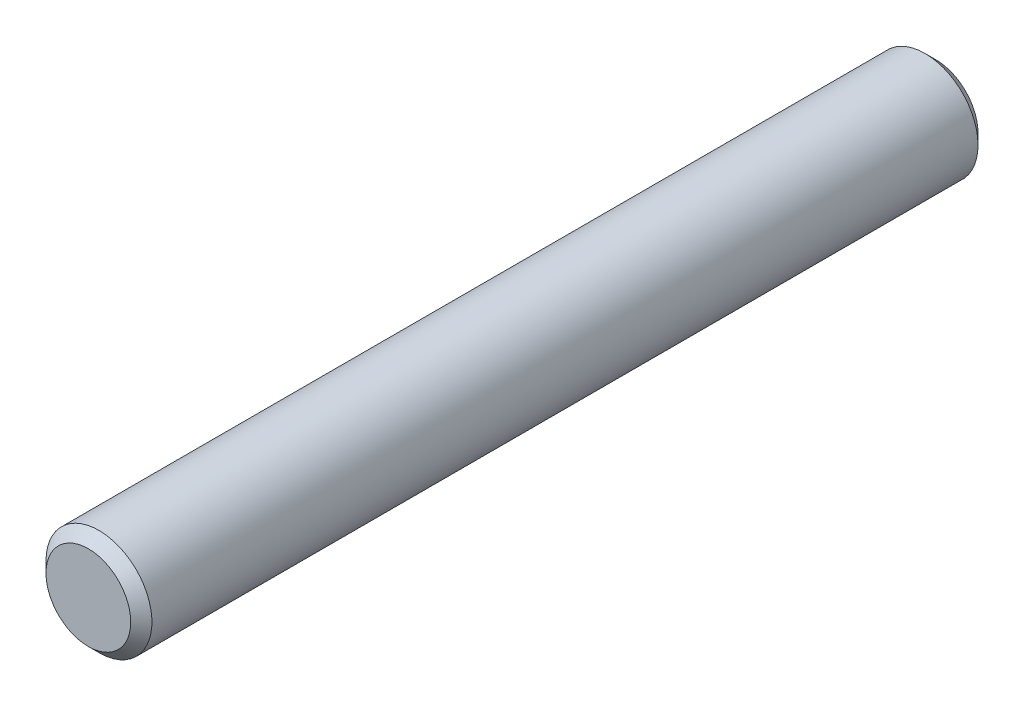
ISO-10303-21;
HEADER;
FILE_DESCRIPTION(('STEP AP214'),'2;1');
FILE_NAME('part.step','',(''),(''),'','','');
FILE_SCHEMA(('AUTOMOTIVE_DESIGN { 1 0 10303 214 1 1 1 1 }'));
ENDSEC;
DATA;
#1=APPLICATION_CONTEXT('core data for automotive mechanical design processes');
#2=APPLICATION_PROTOCOL_DEFINITION('international standard','automotive_design',2000,#1);
#3=PRODUCT_CONTEXT('',#1,'mechanical');
#4=PRODUCT('Part','Part','',(#3));
#5=PRODUCT_RELATED_PRODUCT_CATEGORY('part','',(#4));
#6=PRODUCT_DEFINITION_FORMATION('','',#4);
#7=PRODUCT_DEFINITION_CONTEXT('part definition',#1,'design');
#8=PRODUCT_DEFINITION('design','',#6,#7);
#9=PRODUCT_DEFINITION_SHAPE('','',#8);
#10=(LENGTH_UNIT() NAMED_UNIT(*) SI_UNIT(.MILLI.,.METRE.));
#11=(NAMED_UNIT(*) PLANE_ANGLE_UNIT() SI_UNIT($,.RADIAN.));
#12=(NAMED_UNIT(*) SI_UNIT($,.STERADIAN.) SOLID_ANGLE_UNIT());
#13=UNCERTAINTY_MEASURE_WITH_UNIT(LENGTH_MEASURE(1.E-05),#10,'distance_accuracy_value','');
#14=(GEOMETRIC_REPRESENTATION_CONTEXT(3) GLOBAL_UNCERTAINTY_ASSIGNED_CONTEXT((#13)) GLOBAL_UNIT_ASSIGNED_CONTEXT((#10,
#11,#12)) REPRESENTATION_CONTEXT('',''));
#15=CARTESIAN_POINT('',(0.,0.,0.));
#16=DIRECTION('',(0.,0.,1.));
#17=DIRECTION('',(1.,0.,0.));
#18=AXIS2_PLACEMENT_3D('',#15,#16,#17);
#19=CARTESIAN_POINT('',(0.,0.,38.1));
#20=DIRECTION('',(0.,0.,-1.));
#21=DIRECTION('',(-1.,0.,0.));
#22=AXIS2_PLACEMENT_3D('',#19,#20,#21);
#23=CYLINDRICAL_SURFACE('',#22,4.7625);
#24=CARTESIAN_POINT('',(0.,0.,-37.1474999999999));
#25=DIRECTION('',(0.,0.,1.));
#26=DIRECTION('',(1.,0.,0.));
#27=AXIS2_PLACEMENT_3D('',#24,#25,#26);
#28=CIRCLE('',#27,4.7625);
#29=CARTESIAN_POINT('',(-4.7625,0.,-37.1475));
#30=VERTEX_POINT('',#29);
#31=EDGE_CURVE('E46',#30,#30,#28,.T.);
#32=CARTESIAN_POINT('',(0.,0.,37.1475));
#33=DIRECTION('',(0.,0.,1.));
#34=DIRECTION('',(1.,0.,0.));
#35=AXIS2_PLACEMENT_3D('',#32,#33,#34);
#36=CIRCLE('',#35,4.7625);
#37=CARTESIAN_POINT('',(-4.7625,0.,37.1475));
#38=VERTEX_POINT('',#37);
#39=EDGE_CURVE('E50',#38,#38,#36,.F.);
#40=CARTESIAN_POINT('',(-4.7625,0.,-37.1475));
#41=CARTESIAN_POINT('',(-4.7625,0.,-36.37359375));
#42=CARTESIAN_POINT('',(-4.7625,0.,-35.5996875));
#43=CARTESIAN_POINT('',(-4.7625,0.,-34.051875));
#44=CARTESIAN_POINT('',(-4.7625,0.,-33.27796875));
#45=CARTESIAN_POINT('',(-4.7625,0.,-31.73015625));
#46=CARTESIAN_POINT('',(-4.7625,0.,-30.95625));
#47=CARTESIAN_POINT('',(-4.7625,0.,-29.4084375));
#48=CARTESIAN_POINT('',(-4.7625,0.,-28.63453125));
#49=CARTESIAN_POINT('',(-4.7625,0.,-27.08671875));
#50=CARTESIAN_POINT('',(-4.7625,0.,-26.3128125));
#51=CARTESIAN_POINT('',(-4.7625,0.,-24.765));
#52=CARTESIAN_POINT('',(-4.7625,0.,-23.99109375));
#53=CARTESIAN_POINT('',(-4.7625,0.,-22.44328125));
#54=CARTESIAN_POINT('',(-4.7625,0.,-21.669375));
#55=CARTESIAN_POINT('',(-4.7625,0.,-20.1215625));
#56=CARTESIAN_POINT('',(-4.7625,0.,-19.34765625));
#57=CARTESIAN_POINT('',(-4.7625,0.,-17.79984375));
#58=CARTESIAN_POINT('',(-4.7625,0.,-17.0259375));
#59=CARTESIAN_POINT('',(-4.7625,0.,-15.478125));
#60=CARTESIAN_POINT('',(-4.7625,0.,-14.70421875));
#61=CARTESIAN_POINT('',(-4.7625,0.,-13.15640625));
#62=CARTESIAN_POINT('',(-4.7625,0.,-12.3825));
#63=CARTESIAN_POINT('',(-4.7625,0.,-10.8346875));
#64=CARTESIAN_POINT('',(-4.7625,0.,-10.06078125));
#65=CARTESIAN_POINT('',(-4.7625,0.,-8.51296874999997));
#66=CARTESIAN_POINT('',(-4.7625,0.,-7.73906249999997));
#67=CARTESIAN_POINT('',(-4.7625,0.,-6.19124999999996));
#68=CARTESIAN_POINT('',(-4.7625,0.,-5.41734374999997));
#69=CARTESIAN_POINT('',(-4.7625,0.,-3.86953124999997));
#70=CARTESIAN_POINT('',(-4.7625,0.,-3.09562499999996));
#71=CARTESIAN_POINT('',(-4.7625,0.,-1.54781249999997));
#72=CARTESIAN_POINT('',(-4.7625,0.,-0.773906249999965));
#73=CARTESIAN_POINT('',(-4.7625,0.,0.773906250000035));
#74=CARTESIAN_POINT('',(-4.7625,0.,1.54781250000003));
#75=CARTESIAN_POINT('',(-4.7625,0.,3.09562500000003));
#76=CARTESIAN_POINT('',(-4.7625,0.,3.86953125000003));
#77=CARTESIAN_POINT('',(-4.7625,0.,5.41734375000003));
#78=CARTESIAN_POINT('',(-4.7625,0.,6.19125000000003));
#79=CARTESIAN_POINT('',(-4.7625,0.,7.73906250000003));
#80=CARTESIAN_POINT('',(-4.7625,0.,8.51296875000003));
#81=CARTESIAN_POINT('',(-4.7625,0.,10.06078125));
#82=CARTESIAN_POINT('',(-4.7625,0.,10.8346875));
#83=CARTESIAN_POINT('',(-4.7625,0.,12.3825));
#84=CARTESIAN_POINT('',(-4.7625,0.,13.15640625));
#85=CARTESIAN_POINT('',(-4.7625,0.,14.70421875));
#86=CARTESIAN_POINT('',(-4.7625,0.,15.478125));
#87=CARTESIAN_POINT('',(-4.7625,0.,17.0259375));
#88=CARTESIAN_POINT('',(-4.7625,0.,17.79984375));
#89=CARTESIAN_POINT('',(-4.7625,0.,19.34765625));
#90=CARTESIAN_POINT('',(-4.7625,0.,20.1215625));
#91=CARTESIAN_POINT('',(-4.7625,0.,21.669375));
#92=CARTESIAN_POINT('',(-4.7625,0.,22.44328125));
#93=CARTESIAN_POINT('',(-4.7625,0.,23.99109375));
#94=CARTESIAN_POINT('',(-4.7625,0.,24.765));
#95=CARTESIAN_POINT('',(-4.7625,0.,26.3128125));
#96=CARTESIAN_POINT('',(-4.7625,0.,27.08671875));
#97=CARTESIAN_POINT('',(-4.7625,0.,28.63453125));
#98=CARTESIAN_POINT('',(-4.7625,0.,29.4084375));
#99=CARTESIAN_POINT('',(-4.7625,0.,30.95625));
#100=CARTESIAN_POINT('',(-4.7625,0.,31.73015625));
#101=CARTESIAN_POINT('',(-4.7625,0.,33.27796875));
#102=CARTESIAN_POINT('',(-4.7625,0.,34.051875));
#103=CARTESIAN_POINT('',(-4.7625,0.,35.5996875));
#104=CARTESIAN_POINT('',(-4.7625,0.,36.37359375));
#105=CARTESIAN_POINT('',(-4.7625,0.,37.1475));
#106=B_SPLINE_CURVE_WITH_KNOTS('',3,(#40,#41,#42,#43,#44,#45,#46,#47,#48,#49,#50,#51,#52,#53,
#54,#55,#56,#57,#58,#59,#60,#61,#62,#63,#64,#65,#66,#67,#68,#69,#70,#71,#72,#73,#74,#75,#76,#77,
#78,#79,#80,#81,#82,#83,#84,#85,#86,#87,#88,#89,#90,#91,#92,#93,#94,#95,#96,#97,#98,#99,#100,
#101,#102,#103,#104,#105),.UNSPECIFIED.,.F.,.F.,(4,2,2,2,2,2,2,2,2,2,2,2,2,2,2,2,2,2,2,2,2,2,2,
2,2,2,2,2,2,2,2,2,4),(0.,2.32171874999999,4.6434375,6.96515624999999,9.286875,11.60859375,
13.9303125,16.25203125,18.57375,20.89546875,23.2171875,25.53890625,27.860625,30.18234375,
32.5040625,34.82578125,37.1475,39.46921875,41.7909375,44.11265625,46.434375,48.75609375,
51.0778125,53.39953125,55.72125,58.04296875,60.3646875,62.68640625,65.008125,67.32984375,
69.6515625,71.97328125,74.295),.UNSPECIFIED.);
#107=EDGE_CURVE('BSEAM35',#30,#38,#106,.T.);
#108=ORIENTED_EDGE('',*,*,#31,.T.);
#109=ORIENTED_EDGE('',*,*,#39,.T.);
#110=ORIENTED_EDGE('',*,*,#107,.T.);
#111=ORIENTED_EDGE('',*,*,#107,.F.);
#112=EDGE_LOOP('',(#108,#110,#109,#111));
#113=FACE_BOUND('',#112,.T.);
#114=ADVANCED_FACE('F35',(#113),#23,.T.);
#115=CARTESIAN_POINT('',(0.,0.,38.1));
#116=DIRECTION('',(0.,0.,1.));
#117=DIRECTION('',(1.,0.,0.));
#118=AXIS2_PLACEMENT_3D('',#115,#116,#117);
#119=PLANE('',#118);
#120=CARTESIAN_POINT('',(0.,0.,38.1));
#121=DIRECTION('',(0.,0.,1.));
#122=DIRECTION('',(1.,0.,0.));
#123=AXIS2_PLACEMENT_3D('',#120,#121,#122);
#124=CIRCLE('',#123,3.81000000000003);
#125=CARTESIAN_POINT('',(3.81000000000003,0.,38.1));
#126=VERTEX_POINT('',#125);
#127=EDGE_CURVE('E10',#126,#126,#124,.T.);
#128=ORIENTED_EDGE('',*,*,#127,.T.);
#129=EDGE_LOOP('',(#128));
#130=FACE_BOUND('',#129,.T.);
#131=ADVANCED_FACE('F66',(#130),#119,.T.);
#132=CARTESIAN_POINT('',(0.,0.,-38.1));
#133=DIRECTION('',(0.,0.,1.));
#134=DIRECTION('',(1.,0.,0.));
#135=AXIS2_PLACEMENT_3D('',#132,#133,#134);
#136=PLANE('',#135);
#137=CARTESIAN_POINT('',(0.,0.,-38.1));
#138=DIRECTION('',(0.,0.,1.));
#139=DIRECTION('',(1.,0.,0.));
#140=AXIS2_PLACEMENT_3D('',#137,#138,#139);
#141=CIRCLE('',#140,3.80999999999993);
#142=CARTESIAN_POINT('',(3.80999999999993,0.,-38.1));
#143=VERTEX_POINT('',#142);
#144=EDGE_CURVE('E42',#143,#143,#141,.F.);
#145=ORIENTED_EDGE('',*,*,#144,.T.);
#146=EDGE_LOOP('',(#145));
#147=FACE_BOUND('',#146,.T.);
#148=ADVANCED_FACE('F63',(#147),#136,.F.);
#149=CARTESIAN_POINT('',(0.,0.,-37.1474999999999));
#150=DIRECTION('',(0.,0.,1.));
#151=DIRECTION('',(1.,0.,0.));
#152=AXIS2_PLACEMENT_3D('',#149,#150,#151);
#153=CONICAL_SURFACE('',#152,4.7625,0.785398163397451);
#154=ORIENTED_EDGE('',*,*,#144,.F.);
#155=EDGE_LOOP('',(#154));
#156=FACE_BOUND('',#155,.T.);
#157=ORIENTED_EDGE('',*,*,#31,.F.);
#158=EDGE_LOOP('',(#157));
#159=FACE_BOUND('',#158,.T.);
#160=ADVANCED_FACE('F59',(#156,#159),#153,.T.);
#161=CARTESIAN_POINT('',(0.,0.,38.1));
#162=DIRECTION('',(0.,0.,-1.));
#163=DIRECTION('',(-1.,0.,0.));
#164=AXIS2_PLACEMENT_3D('',#161,#162,#163);
#165=CONICAL_SURFACE('',#164,3.81000000000003,0.785398163397444);
#166=ORIENTED_EDGE('',*,*,#39,.F.);
#167=EDGE_LOOP('',(#166));
#168=FACE_BOUND('',#167,.T.);
#169=ORIENTED_EDGE('',*,*,#127,.F.);
#170=EDGE_LOOP('',(#169));
#171=FACE_BOUND('',#170,.T.);
#172=ADVANCED_FACE('F37',(#168,#171),#165,.T.);
#173=CLOSED_SHELL('',(#114,#131,#148,#160,#172));
#174=MANIFOLD_SOLID_BREP('B2',#173);
#175=ADVANCED_BREP_SHAPE_REPRESENTATION('',(#18,#174),#14);
#176=SHAPE_DEFINITION_REPRESENTATION(#9,#175);
ENDSEC;
END-ISO-10303-21;
